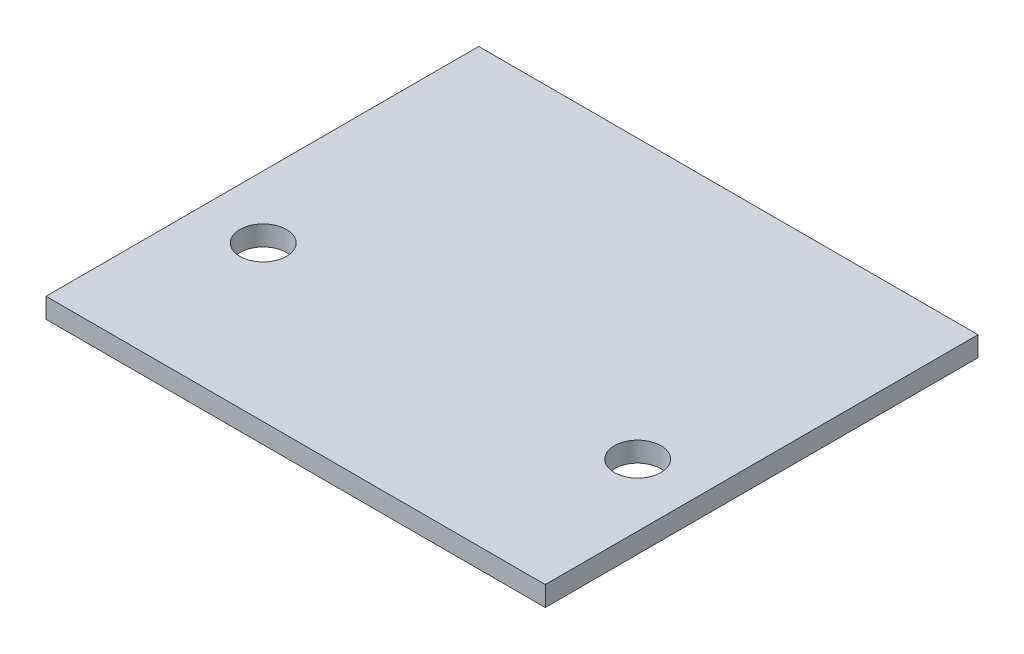
ISO-10303-21;
HEADER;
FILE_DESCRIPTION(('STEP AP214'),'2;1');
FILE_NAME('part.step','',(''),(''),'','','');
FILE_SCHEMA(('AUTOMOTIVE_DESIGN { 1 0 10303 214 1 1 1 1 }'));
ENDSEC;
DATA;
#1=APPLICATION_CONTEXT('core data for automotive mechanical design processes');
#2=APPLICATION_PROTOCOL_DEFINITION('international standard','automotive_design',2000,#1);
#3=PRODUCT_CONTEXT('',#1,'mechanical');
#4=PRODUCT('Part','Part','',(#3));
#5=PRODUCT_RELATED_PRODUCT_CATEGORY('part','',(#4));
#6=PRODUCT_DEFINITION_FORMATION('','',#4);
#7=PRODUCT_DEFINITION_CONTEXT('part definition',#1,'design');
#8=PRODUCT_DEFINITION('design','',#6,#7);
#9=PRODUCT_DEFINITION_SHAPE('','',#8);
#10=(LENGTH_UNIT() NAMED_UNIT(*) SI_UNIT(.MILLI.,.METRE.));
#11=(NAMED_UNIT(*) PLANE_ANGLE_UNIT() SI_UNIT($,.RADIAN.));
#12=(NAMED_UNIT(*) SI_UNIT($,.STERADIAN.) SOLID_ANGLE_UNIT());
#13=UNCERTAINTY_MEASURE_WITH_UNIT(LENGTH_MEASURE(1.E-05),#10,'distance_accuracy_value','');
#14=(GEOMETRIC_REPRESENTATION_CONTEXT(3) GLOBAL_UNCERTAINTY_ASSIGNED_CONTEXT((#13)) GLOBAL_UNIT_ASSIGNED_CONTEXT((#10,
#11,#12)) REPRESENTATION_CONTEXT('',''));
#15=CARTESIAN_POINT('',(0.,0.,0.));
#16=DIRECTION('',(0.,0.,1.));
#17=DIRECTION('',(1.,0.,0.));
#18=AXIS2_PLACEMENT_3D('',#15,#16,#17);
#19=CARTESIAN_POINT('',(0.,1.2,0.));
#20=DIRECTION('',(0.,-1.,0.));
#21=DIRECTION('',(0.,0.,-1.));
#22=AXIS2_PLACEMENT_3D('',#19,#20,#21);
#23=PLANE('',#22);
#24=DIRECTION('',(0.,0.,-1.));
#25=VECTOR('',#24,1.);
#26=CARTESIAN_POINT('',(15.,1.2,13.));
#27=LINE('',#26,#25);
#28=CARTESIAN_POINT('',(15.,1.2,13.));
#29=VERTEX_POINT('',#28);
#30=CARTESIAN_POINT('',(15.,1.2,-13.));
#31=VERTEX_POINT('',#30);
#32=EDGE_CURVE('E87',#29,#31,#27,.T.);
#33=ORIENTED_EDGE('',*,*,#32,.T.);
#34=DIRECTION('',(-1.,0.,0.));
#35=VECTOR('',#34,1.);
#36=CARTESIAN_POINT('',(-15.,1.2,-13.));
#37=LINE('',#36,#35);
#38=CARTESIAN_POINT('',(-15.,1.2,-13.));
#39=VERTEX_POINT('',#38);
#40=EDGE_CURVE('E82',#31,#39,#37,.T.);
#41=ORIENTED_EDGE('',*,*,#40,.T.);
#42=DIRECTION('',(0.,0.,1.));
#43=VECTOR('',#42,1.);
#44=CARTESIAN_POINT('',(-15.,1.2,13.));
#45=LINE('',#44,#43);
#46=CARTESIAN_POINT('',(-15.,1.2,13.));
#47=VERTEX_POINT('',#46);
#48=EDGE_CURVE('E85',#39,#47,#45,.T.);
#49=ORIENTED_EDGE('',*,*,#48,.T.);
#50=DIRECTION('',(1.,0.,0.));
#51=VECTOR('',#50,1.);
#52=CARTESIAN_POINT('',(-15.,1.2,13.));
#53=LINE('',#52,#51);
#54=EDGE_CURVE('E52',#47,#29,#53,.T.);
#55=ORIENTED_EDGE('',*,*,#54,.T.);
#56=EDGE_LOOP('',(#33,#41,#49,#55));
#57=FACE_BOUND('',#56,.T.);
#58=CARTESIAN_POINT('',(-11.25,1.2,3.7));
#59=DIRECTION('',(0.,1.,0.));
#60=DIRECTION('',(0.,0.,1.));
#61=AXIS2_PLACEMENT_3D('',#58,#59,#60);
#62=CIRCLE('',#61,1.4);
#63=CARTESIAN_POINT('',(-11.25,1.2,5.1));
#64=VERTEX_POINT('',#63);
#65=EDGE_CURVE('E102',#64,#64,#62,.T.);
#66=ORIENTED_EDGE('',*,*,#65,.F.);
#67=EDGE_LOOP('',(#66));
#68=FACE_BOUND('',#67,.T.);
#69=CARTESIAN_POINT('',(11.25,1.2,3.7));
#70=DIRECTION('',(0.,1.,0.));
#71=DIRECTION('',(0.,0.,-1.));
#72=AXIS2_PLACEMENT_3D('',#69,#70,#71);
#73=CIRCLE('',#72,1.4);
#74=CARTESIAN_POINT('',(11.25,1.2,2.3));
#75=VERTEX_POINT('',#74);
#76=EDGE_CURVE('E117',#75,#75,#73,.T.);
#77=ORIENTED_EDGE('',*,*,#76,.F.);
#78=EDGE_LOOP('',(#77));
#79=FACE_BOUND('',#78,.T.);
#80=ADVANCED_FACE('F35',(#57,#68,#79),#23,.F.);
#81=CARTESIAN_POINT('',(0.,0.,0.));
#82=DIRECTION('',(0.,-1.,0.));
#83=DIRECTION('',(0.,0.,-1.));
#84=AXIS2_PLACEMENT_3D('',#81,#82,#83);
#85=PLANE('',#84);
#86=CARTESIAN_POINT('',(-11.25,0.,3.7));
#87=DIRECTION('',(0.,1.,0.));
#88=DIRECTION('',(0.,0.,1.));
#89=AXIS2_PLACEMENT_3D('',#86,#87,#88);
#90=CIRCLE('',#89,1.4);
#91=CARTESIAN_POINT('',(-11.25,0.,5.1));
#92=VERTEX_POINT('',#91);
#93=EDGE_CURVE('E114',#92,#92,#90,.T.);
#94=ORIENTED_EDGE('',*,*,#93,.T.);
#95=EDGE_LOOP('',(#94));
#96=FACE_BOUND('',#95,.T.);
#97=DIRECTION('',(0.,0.,-1.));
#98=VECTOR('',#97,1.);
#99=CARTESIAN_POINT('',(15.,0.,13.));
#100=LINE('',#99,#98);
#101=CARTESIAN_POINT('',(15.,0.,13.));
#102=VERTEX_POINT('',#101);
#103=CARTESIAN_POINT('',(15.,0.,-13.));
#104=VERTEX_POINT('',#103);
#105=EDGE_CURVE('E99',#102,#104,#100,.T.);
#106=ORIENTED_EDGE('',*,*,#105,.F.);
#107=DIRECTION('',(1.,0.,0.));
#108=VECTOR('',#107,1.);
#109=CARTESIAN_POINT('',(-15.,0.,13.));
#110=LINE('',#109,#108);
#111=CARTESIAN_POINT('',(-15.,0.,13.));
#112=VERTEX_POINT('',#111);
#113=EDGE_CURVE('E75',#112,#102,#110,.T.);
#114=ORIENTED_EDGE('',*,*,#113,.F.);
#115=DIRECTION('',(0.,0.,1.));
#116=VECTOR('',#115,1.);
#117=CARTESIAN_POINT('',(-15.,0.,13.));
#118=LINE('',#117,#116);
#119=CARTESIAN_POINT('',(-15.,0.,-13.));
#120=VERTEX_POINT('',#119);
#121=EDGE_CURVE('E69',#120,#112,#118,.T.);
#122=ORIENTED_EDGE('',*,*,#121,.F.);
#123=DIRECTION('',(-1.,0.,0.));
#124=VECTOR('',#123,1.);
#125=CARTESIAN_POINT('',(-15.,0.,-13.));
#126=LINE('',#125,#124);
#127=EDGE_CURVE('E91',#104,#120,#126,.T.);
#128=ORIENTED_EDGE('',*,*,#127,.F.);
#129=EDGE_LOOP('',(#106,#114,#122,#128));
#130=FACE_BOUND('',#129,.T.);
#131=CARTESIAN_POINT('',(11.25,0.,3.7));
#132=DIRECTION('',(0.,1.,0.));
#133=DIRECTION('',(0.,0.,-1.));
#134=AXIS2_PLACEMENT_3D('',#131,#132,#133);
#135=CIRCLE('',#134,1.4);
#136=CARTESIAN_POINT('',(11.25,0.,2.3));
#137=VERTEX_POINT('',#136);
#138=EDGE_CURVE('E120',#137,#137,#135,.T.);
#139=ORIENTED_EDGE('',*,*,#138,.T.);
#140=EDGE_LOOP('',(#139));
#141=FACE_BOUND('',#140,.T.);
#142=ADVANCED_FACE('F110',(#96,#130,#141),#85,.T.);
#143=CARTESIAN_POINT('',(15.,1.2,13.));
#144=DIRECTION('',(-1.,0.,0.));
#145=DIRECTION('',(0.,0.,1.));
#146=AXIS2_PLACEMENT_3D('',#143,#144,#145);
#147=PLANE('',#146);
#148=ORIENTED_EDGE('',*,*,#105,.T.);
#149=DIRECTION('',(0.,-1.,0.));
#150=VECTOR('',#149,1.);
#151=CARTESIAN_POINT('',(15.,1.2,-13.));
#152=LINE('',#151,#150);
#153=EDGE_CURVE('E11',#31,#104,#152,.T.);
#154=ORIENTED_EDGE('',*,*,#153,.F.);
#155=ORIENTED_EDGE('',*,*,#32,.F.);
#156=DIRECTION('',(0.,-1.,0.));
#157=VECTOR('',#156,1.);
#158=CARTESIAN_POINT('',(15.,1.2,13.));
#159=LINE('',#158,#157);
#160=EDGE_CURVE('E95',#29,#102,#159,.T.);
#161=ORIENTED_EDGE('',*,*,#160,.T.);
#162=EDGE_LOOP('',(#148,#154,#155,#161));
#163=FACE_BOUND('',#162,.T.);
#164=ADVANCED_FACE('F37',(#163),#147,.F.);
#165=CARTESIAN_POINT('',(-15.,1.2,-13.));
#166=DIRECTION('',(0.,0.,1.));
#167=DIRECTION('',(1.,0.,0.));
#168=AXIS2_PLACEMENT_3D('',#165,#166,#167);
#169=PLANE('',#168);
#170=ORIENTED_EDGE('',*,*,#127,.T.);
#171=DIRECTION('',(0.,-1.,0.));
#172=VECTOR('',#171,1.);
#173=CARTESIAN_POINT('',(-15.,1.2,-13.));
#174=LINE('',#173,#172);
#175=EDGE_CURVE('E44',#39,#120,#174,.T.);
#176=ORIENTED_EDGE('',*,*,#175,.F.);
#177=ORIENTED_EDGE('',*,*,#40,.F.);
#178=ORIENTED_EDGE('',*,*,#153,.T.);
#179=EDGE_LOOP('',(#170,#176,#177,#178));
#180=FACE_BOUND('',#179,.T.);
#181=ADVANCED_FACE('F90',(#180),#169,.F.);
#182=CARTESIAN_POINT('',(-15.,1.2,13.));
#183=DIRECTION('',(1.,0.,0.));
#184=DIRECTION('',(0.,0.,-1.));
#185=AXIS2_PLACEMENT_3D('',#182,#183,#184);
#186=PLANE('',#185);
#187=ORIENTED_EDGE('',*,*,#121,.T.);
#188=DIRECTION('',(0.,-1.,0.));
#189=VECTOR('',#188,1.);
#190=CARTESIAN_POINT('',(-15.,1.2,13.));
#191=LINE('',#190,#189);
#192=EDGE_CURVE('E92',#47,#112,#191,.T.);
#193=ORIENTED_EDGE('',*,*,#192,.F.);
#194=ORIENTED_EDGE('',*,*,#48,.F.);
#195=ORIENTED_EDGE('',*,*,#175,.T.);
#196=EDGE_LOOP('',(#187,#193,#194,#195));
#197=FACE_BOUND('',#196,.T.);
#198=ADVANCED_FACE('F93',(#197),#186,.F.);
#199=CARTESIAN_POINT('',(-15.,1.2,13.));
#200=DIRECTION('',(0.,0.,-1.));
#201=DIRECTION('',(-1.,0.,0.));
#202=AXIS2_PLACEMENT_3D('',#199,#200,#201);
#203=PLANE('',#202);
#204=ORIENTED_EDGE('',*,*,#113,.T.);
#205=ORIENTED_EDGE('',*,*,#160,.F.);
#206=ORIENTED_EDGE('',*,*,#54,.F.);
#207=ORIENTED_EDGE('',*,*,#192,.T.);
#208=EDGE_LOOP('',(#204,#205,#206,#207));
#209=FACE_BOUND('',#208,.T.);
#210=ADVANCED_FACE('F107',(#209),#203,.F.);
#211=CARTESIAN_POINT('',(-11.25,1.2,3.7));
#212=DIRECTION('',(0.,-1.,0.));
#213=DIRECTION('',(0.,0.,-1.));
#214=AXIS2_PLACEMENT_3D('',#211,#212,#213);
#215=CYLINDRICAL_SURFACE('',#214,1.4);
#216=ORIENTED_EDGE('',*,*,#65,.T.);
#217=EDGE_LOOP('',(#216));
#218=FACE_BOUND('',#217,.T.);
#219=ORIENTED_EDGE('',*,*,#93,.F.);
#220=EDGE_LOOP('',(#219));
#221=FACE_BOUND('',#220,.T.);
#222=ADVANCED_FACE('F137',(#218,#221),#215,.F.);
#223=CARTESIAN_POINT('',(11.25,1.2,3.7));
#224=DIRECTION('',(0.,-1.,0.));
#225=DIRECTION('',(0.,0.,-1.));
#226=AXIS2_PLACEMENT_3D('',#223,#224,#225);
#227=CYLINDRICAL_SURFACE('',#226,1.4);
#228=ORIENTED_EDGE('',*,*,#76,.T.);
#229=EDGE_LOOP('',(#228));
#230=FACE_BOUND('',#229,.T.);
#231=ORIENTED_EDGE('',*,*,#138,.F.);
#232=EDGE_LOOP('',(#231));
#233=FACE_BOUND('',#232,.T.);
#234=ADVANCED_FACE('F126',(#230,#233),#227,.F.);
#235=CLOSED_SHELL('',(#80,#142,#164,#181,#198,#210,#222,#234));
#236=MANIFOLD_SOLID_BREP('B2',#235);
#237=ADVANCED_BREP_SHAPE_REPRESENTATION('',(#18,#236),#14);
#238=SHAPE_DEFINITION_REPRESENTATION(#9,#237);
ENDSEC;
END-ISO-10303-21;
